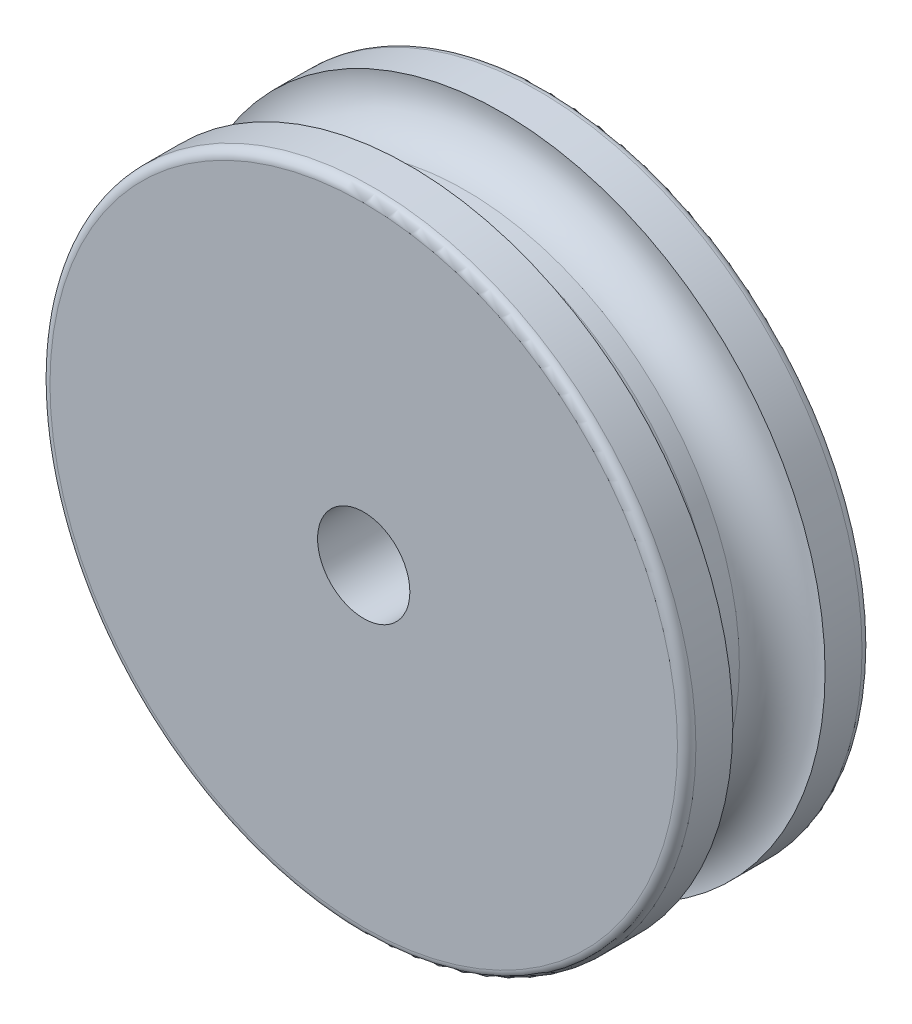
ISO-10303-21;
HEADER;
FILE_DESCRIPTION(('STEP AP214'),'2;1');
FILE_NAME('part.step','',(''),(''),'','','');
FILE_SCHEMA(('AUTOMOTIVE_DESIGN { 1 0 10303 214 1 1 1 1 }'));
ENDSEC;
DATA;
#1=APPLICATION_CONTEXT('core data for automotive mechanical design processes');
#2=APPLICATION_PROTOCOL_DEFINITION('international standard','automotive_design',2000,#1);
#3=PRODUCT_CONTEXT('',#1,'mechanical');
#4=PRODUCT('Part','Part','',(#3));
#5=PRODUCT_RELATED_PRODUCT_CATEGORY('part','',(#4));
#6=PRODUCT_DEFINITION_FORMATION('','',#4);
#7=PRODUCT_DEFINITION_CONTEXT('part definition',#1,'design');
#8=PRODUCT_DEFINITION('design','',#6,#7);
#9=PRODUCT_DEFINITION_SHAPE('','',#8);
#10=(LENGTH_UNIT() NAMED_UNIT(*) SI_UNIT(.MILLI.,.METRE.));
#11=(NAMED_UNIT(*) PLANE_ANGLE_UNIT() SI_UNIT($,.RADIAN.));
#12=(NAMED_UNIT(*) SI_UNIT($,.STERADIAN.) SOLID_ANGLE_UNIT());
#13=UNCERTAINTY_MEASURE_WITH_UNIT(LENGTH_MEASURE(1.E-05),#10,'distance_accuracy_value','');
#14=(GEOMETRIC_REPRESENTATION_CONTEXT(3) GLOBAL_UNCERTAINTY_ASSIGNED_CONTEXT((#13)) GLOBAL_UNIT_ASSIGNED_CONTEXT((#10,
#11,#12)) REPRESENTATION_CONTEXT('',''));
#15=CARTESIAN_POINT('',(0.,0.,0.));
#16=DIRECTION('',(0.,0.,1.));
#17=DIRECTION('',(1.,0.,0.));
#18=AXIS2_PLACEMENT_3D('',#15,#16,#17);
#19=CARTESIAN_POINT('',(-553.234692624039,615.626439551163,-167.729898731527));
#20=DIRECTION('',(0.,0.,1.));
#21=DIRECTION('',(1.,0.,0.));
#22=AXIS2_PLACEMENT_3D('',#19,#20,#21);
#23=CYLINDRICAL_SURFACE('',#22,69.9999999997507);
#24=CARTESIAN_POINT('',(-553.234692624039,615.626439551163,32.2600000000007));
#25=DIRECTION('',(0.,0.,1.));
#26=DIRECTION('',(1.,0.,0.));
#27=AXIS2_PLACEMENT_3D('',#24,#25,#26);
#28=CIRCLE('',#27,69.9999999997507);
#29=CARTESIAN_POINT('',(-483.234692624288,615.626439551163,32.2600000000007));
#30=VERTEX_POINT('',#29);
#31=EDGE_CURVE('E47',#30,#30,#28,.T.);
#32=ORIENTED_EDGE('',*,*,#31,.T.);
#33=EDGE_LOOP('',(#32));
#34=FACE_BOUND('',#33,.T.);
#35=CARTESIAN_POINT('',(-553.234692624039,615.626439551163,40.2599999999997));
#36=DIRECTION('',(0.,0.,1.));
#37=DIRECTION('',(1.,0.,0.));
#38=AXIS2_PLACEMENT_3D('',#35,#36,#37);
#39=CIRCLE('',#38,70.0000000000007);
#40=CARTESIAN_POINT('',(-483.234692624038,615.626439551163,40.2599999999997));
#41=VERTEX_POINT('',#40);
#42=EDGE_CURVE('E71',#41,#41,#39,.T.);
#43=ORIENTED_EDGE('',*,*,#42,.F.);
#44=EDGE_LOOP('',(#43));
#45=FACE_BOUND('',#44,.T.);
#46=ADVANCED_FACE('F36',(#34,#45),#23,.T.);
#47=CARTESIAN_POINT('',(-553.234692624039,615.626439551163,68.26));
#48=DIRECTION('',(0.,0.,1.));
#49=DIRECTION('',(1.,0.,0.));
#50=AXIS2_PLACEMENT_3D('',#47,#48,#49);
#51=CIRCLE('',#50,69.9999999997507);
#52=CARTESIAN_POINT('',(-483.234692624288,615.626439551163,68.26));
#53=VERTEX_POINT('',#52);
#54=EDGE_CURVE('E10',#53,#53,#51,.F.);
#55=ORIENTED_EDGE('',*,*,#54,.T.);
#56=EDGE_LOOP('',(#55));
#57=FACE_BOUND('',#56,.T.);
#58=CARTESIAN_POINT('',(-553.234692624039,615.626439551163,60.2600000000011));
#59=DIRECTION('',(0.,0.,1.));
#60=DIRECTION('',(1.,0.,0.));
#61=AXIS2_PLACEMENT_3D('',#58,#59,#60);
#62=CIRCLE('',#61,70.0000000000007);
#63=CARTESIAN_POINT('',(-483.234692624038,615.626439551163,60.2600000000011));
#64=VERTEX_POINT('',#63);
#65=EDGE_CURVE('E68',#64,#64,#62,.T.);
#66=ORIENTED_EDGE('',*,*,#65,.T.);
#67=EDGE_LOOP('',(#66));
#68=FACE_BOUND('',#67,.T.);
#69=ADVANCED_FACE('F78',(#57,#68),#23,.T.);
#70=CARTESIAN_POINT('',(-553.234692624039,615.626439551163,70.26));
#71=DIRECTION('',(0.,0.,1.));
#72=DIRECTION('',(1.,0.,0.));
#73=AXIS2_PLACEMENT_3D('',#70,#71,#72);
#74=PLANE('',#73);
#75=CARTESIAN_POINT('',(-553.234692624039,615.626439551163,70.26));
#76=DIRECTION('',(0.,0.,1.));
#77=DIRECTION('',(1.,0.,0.));
#78=AXIS2_PLACEMENT_3D('',#75,#76,#77);
#79=CIRCLE('',#78,67.9999999997507);
#80=CARTESIAN_POINT('',(-485.234692624288,615.626439551163,70.26));
#81=VERTEX_POINT('',#80);
#82=EDGE_CURVE('E43',#81,#81,#79,.T.);
#83=ORIENTED_EDGE('',*,*,#82,.T.);
#84=EDGE_LOOP('',(#83));
#85=FACE_BOUND('',#84,.T.);
#86=CARTESIAN_POINT('',(-553.234692624039,615.626439551163,70.26));
#87=DIRECTION('',(0.,0.,1.));
#88=DIRECTION('',(1.,0.,0.));
#89=AXIS2_PLACEMENT_3D('',#86,#87,#88);
#90=CIRCLE('',#89,9.99999999999988);
#91=CARTESIAN_POINT('',(-543.234692624039,615.626439551163,70.26));
#92=VERTEX_POINT('',#91);
#93=EDGE_CURVE('E57',#92,#92,#90,.T.);
#94=ORIENTED_EDGE('',*,*,#93,.F.);
#95=EDGE_LOOP('',(#94));
#96=FACE_BOUND('',#95,.T.);
#97=ADVANCED_FACE('F84',(#85,#96),#74,.T.);
#98=CARTESIAN_POINT('',(53.9760949491153,-523.178523142196,30.2600000000007));
#99=DIRECTION('',(0.,0.,1.));
#100=DIRECTION('',(1.,0.,0.));
#101=AXIS2_PLACEMENT_3D('',#98,#99,#100);
#102=PLANE('',#101);
#103=CARTESIAN_POINT('',(-553.234692624039,615.626439551163,30.2600000000007));
#104=DIRECTION('',(0.,0.,1.));
#105=DIRECTION('',(1.,0.,0.));
#106=AXIS2_PLACEMENT_3D('',#103,#104,#105);
#107=CIRCLE('',#106,67.9999999997507);
#108=CARTESIAN_POINT('',(-485.234692624288,615.626439551163,30.2600000000007));
#109=VERTEX_POINT('',#108);
#110=EDGE_CURVE('E51',#109,#109,#107,.F.);
#111=ORIENTED_EDGE('',*,*,#110,.T.);
#112=EDGE_LOOP('',(#111));
#113=FACE_BOUND('',#112,.T.);
#114=CARTESIAN_POINT('',(-553.234692624039,615.626439551163,30.2600000000007));
#115=DIRECTION('',(0.,0.,1.));
#116=DIRECTION('',(1.,0.,0.));
#117=AXIS2_PLACEMENT_3D('',#114,#115,#116);
#118=CIRCLE('',#117,9.99999999999988);
#119=CARTESIAN_POINT('',(-543.234692624039,615.626439551163,30.2600000000007));
#120=VERTEX_POINT('',#119);
#121=EDGE_CURVE('E56',#120,#120,#118,.T.);
#122=ORIENTED_EDGE('',*,*,#121,.T.);
#123=EDGE_LOOP('',(#122));
#124=FACE_BOUND('',#123,.T.);
#125=ADVANCED_FACE('F103',(#113,#124),#102,.F.);
#126=CARTESIAN_POINT('',(-553.234692624039,615.626439551163,-10.577191625433));
#127=DIRECTION('',(0.,0.,1.));
#128=DIRECTION('',(1.,0.,0.));
#129=AXIS2_PLACEMENT_3D('',#126,#127,#128);
#130=CYLINDRICAL_SURFACE('',#129,9.99999999999988);
#131=ORIENTED_EDGE('',*,*,#121,.F.);
#132=EDGE_LOOP('',(#131));
#133=FACE_BOUND('',#132,.T.);
#134=ORIENTED_EDGE('',*,*,#93,.T.);
#135=EDGE_LOOP('',(#134));
#136=FACE_BOUND('',#135,.T.);
#137=ADVANCED_FACE('F106',(#133,#136),#130,.F.);
#138=CARTESIAN_POINT('',(-553.234692624039,615.626439551163,49.5496852526567));
#139=DIRECTION('',(0.,0.,1.));
#140=DIRECTION('',(1.,0.,0.));
#141=AXIS2_PLACEMENT_3D('',#138,#139,#140);
#142=TOROIDAL_SURFACE('',#141,68.710314747344,9.37878137842829);
#143=CARTESIAN_POINT('',(-553.234692624039,615.626439551163,48.2600000000011));
#144=DIRECTION('',(0.,0.,1.));
#145=DIRECTION('',(1.,0.,0.));
#146=AXIS2_PLACEMENT_3D('',#143,#144,#145);
#147=CIRCLE('',#146,59.4206294946868);
#148=CARTESIAN_POINT('',(-493.814063129352,615.626439551163,48.2600000000011));
#149=VERTEX_POINT('',#148);
#150=EDGE_CURVE('E60',#149,#149,#147,.T.);
#151=ORIENTED_EDGE('',*,*,#150,.F.);
#152=EDGE_LOOP('',(#151));
#153=FACE_BOUND('',#152,.T.);
#154=ORIENTED_EDGE('',*,*,#42,.T.);
#155=EDGE_LOOP('',(#154));
#156=FACE_BOUND('',#155,.T.);
#157=ADVANCED_FACE('F75',(#153,#156),#142,.F.);
#158=CARTESIAN_POINT('',(-553.234692624039,615.626439551163,70.26));
#159=DIRECTION('',(0.,0.,1.));
#160=DIRECTION('',(1.,0.,0.));
#161=AXIS2_PLACEMENT_3D('',#158,#159,#160);
#162=CYLINDRICAL_SURFACE('',#161,59.4206294946868);
#163=CARTESIAN_POINT('',(-553.234692624039,615.626439551163,52.2599999999997));
#164=DIRECTION('',(0.,0.,1.));
#165=DIRECTION('',(1.,0.,0.));
#166=AXIS2_PLACEMENT_3D('',#163,#164,#165);
#167=CIRCLE('',#166,59.4206294946868);
#168=CARTESIAN_POINT('',(-493.814063129352,615.626439551163,52.2599999999997));
#169=VERTEX_POINT('',#168);
#170=EDGE_CURVE('E65',#169,#169,#167,.T.);
#171=ORIENTED_EDGE('',*,*,#170,.F.);
#172=EDGE_LOOP('',(#171));
#173=FACE_BOUND('',#172,.T.);
#174=ORIENTED_EDGE('',*,*,#150,.T.);
#175=EDGE_LOOP('',(#174));
#176=FACE_BOUND('',#175,.T.);
#177=ADVANCED_FACE('F96',(#173,#176),#162,.T.);
#178=CARTESIAN_POINT('',(-553.234692624039,615.626439551163,50.9703147473437));
#179=DIRECTION('',(0.,0.,1.));
#180=DIRECTION('',(1.,0.,0.));
#181=AXIS2_PLACEMENT_3D('',#178,#179,#180);
#182=TOROIDAL_SURFACE('',#181,68.7103147473443,9.37878137842865);
#183=ORIENTED_EDGE('',*,*,#65,.F.);
#184=EDGE_LOOP('',(#183));
#185=FACE_BOUND('',#184,.T.);
#186=ORIENTED_EDGE('',*,*,#170,.T.);
#187=EDGE_LOOP('',(#186));
#188=FACE_BOUND('',#187,.T.);
#189=ADVANCED_FACE('F89',(#185,#188),#182,.F.);
#190=CARTESIAN_POINT('',(-553.234692624039,615.626439551163,32.2600000000007));
#191=DIRECTION('',(0.,0.,1.));
#192=DIRECTION('',(1.,0.,0.));
#193=AXIS2_PLACEMENT_3D('',#190,#191,#192);
#194=TOROIDAL_SURFACE('',#193,67.9999999997507,2.);
#195=ORIENTED_EDGE('',*,*,#31,.F.);
#196=EDGE_LOOP('',(#195));
#197=FACE_BOUND('',#196,.T.);
#198=ORIENTED_EDGE('',*,*,#110,.F.);
#199=EDGE_LOOP('',(#198));
#200=FACE_BOUND('',#199,.T.);
#201=ADVANCED_FACE('F87',(#197,#200),#194,.T.);
#202=CARTESIAN_POINT('',(-553.234692624039,615.626439551163,68.26));
#203=DIRECTION('',(0.,0.,1.));
#204=DIRECTION('',(1.,0.,0.));
#205=AXIS2_PLACEMENT_3D('',#202,#203,#204);
#206=TOROIDAL_SURFACE('',#205,67.9999999997507,2.);
#207=ORIENTED_EDGE('',*,*,#54,.F.);
#208=EDGE_LOOP('',(#207));
#209=FACE_BOUND('',#208,.T.);
#210=ORIENTED_EDGE('',*,*,#82,.F.);
#211=EDGE_LOOP('',(#210));
#212=FACE_BOUND('',#211,.T.);
#213=ADVANCED_FACE('F38',(#209,#212),#206,.T.);
#214=CLOSED_SHELL('',(#46,#69,#97,#125,#137,#157,#177,#189,#201,#213));
#215=MANIFOLD_SOLID_BREP('B2',#214);
#216=ADVANCED_BREP_SHAPE_REPRESENTATION('',(#18,#215),#14);
#217=SHAPE_DEFINITION_REPRESENTATION(#9,#216);
ENDSEC;
END-ISO-10303-21;
